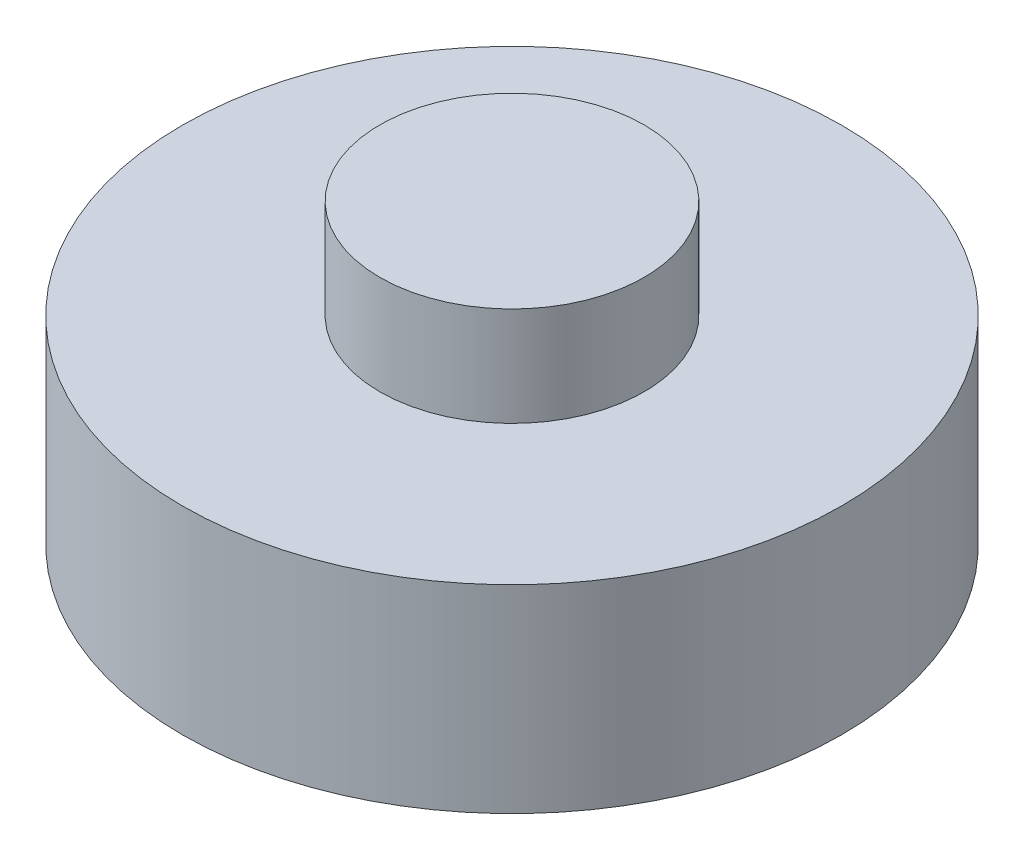
ISO-10303-21;
HEADER;
FILE_DESCRIPTION(('STEP AP214'),'2;1');
FILE_NAME('part.step','',(''),(''),'','','');
FILE_SCHEMA(('AUTOMOTIVE_DESIGN { 1 0 10303 214 1 1 1 1 }'));
ENDSEC;
DATA;
#1=APPLICATION_CONTEXT('core data for automotive mechanical design processes');
#2=APPLICATION_PROTOCOL_DEFINITION('international standard','automotive_design',2000,#1);
#3=PRODUCT_CONTEXT('',#1,'mechanical');
#4=PRODUCT('Part','Part','',(#3));
#5=PRODUCT_RELATED_PRODUCT_CATEGORY('part','',(#4));
#6=PRODUCT_DEFINITION_FORMATION('','',#4);
#7=PRODUCT_DEFINITION_CONTEXT('part definition',#1,'design');
#8=PRODUCT_DEFINITION('design','',#6,#7);
#9=PRODUCT_DEFINITION_SHAPE('','',#8);
#10=(LENGTH_UNIT() NAMED_UNIT(*) SI_UNIT(.MILLI.,.METRE.));
#11=(NAMED_UNIT(*) PLANE_ANGLE_UNIT() SI_UNIT($,.RADIAN.));
#12=(NAMED_UNIT(*) SI_UNIT($,.STERADIAN.) SOLID_ANGLE_UNIT());
#13=UNCERTAINTY_MEASURE_WITH_UNIT(LENGTH_MEASURE(1.E-05),#10,'distance_accuracy_value','');
#14=(GEOMETRIC_REPRESENTATION_CONTEXT(3) GLOBAL_UNCERTAINTY_ASSIGNED_CONTEXT((#13)) GLOBAL_UNIT_ASSIGNED_CONTEXT((#10,
#11,#12)) REPRESENTATION_CONTEXT('',''));
#15=CARTESIAN_POINT('',(0.,0.,0.));
#16=DIRECTION('',(0.,0.,1.));
#17=DIRECTION('',(1.,0.,0.));
#18=AXIS2_PLACEMENT_3D('',#15,#16,#17);
#19=CARTESIAN_POINT('',(0.,30.,0.));
#20=DIRECTION('',(0.,-1.,0.));
#21=DIRECTION('',(0.,0.,-1.));
#22=AXIS2_PLACEMENT_3D('',#19,#20,#21);
#23=CYLINDRICAL_SURFACE('',#22,49.9);
#24=CARTESIAN_POINT('',(0.,30.,0.));
#25=DIRECTION('',(0.,1.,0.));
#26=DIRECTION('',(0.,0.,1.));
#27=AXIS2_PLACEMENT_3D('',#24,#25,#26);
#28=CIRCLE('',#27,49.9);
#29=CARTESIAN_POINT('',(0.,30.,49.9));
#30=VERTEX_POINT('',#29);
#31=EDGE_CURVE('E43',#30,#30,#28,.T.);
#32=ORIENTED_EDGE('',*,*,#31,.F.);
#33=EDGE_LOOP('',(#32));
#34=FACE_BOUND('',#33,.T.);
#35=CARTESIAN_POINT('',(0.,0.,0.));
#36=DIRECTION('',(0.,1.,0.));
#37=DIRECTION('',(0.,0.,1.));
#38=AXIS2_PLACEMENT_3D('',#35,#36,#37);
#39=CIRCLE('',#38,49.9);
#40=CARTESIAN_POINT('',(0.,0.,49.9));
#41=VERTEX_POINT('',#40);
#42=EDGE_CURVE('E39',#41,#41,#39,.T.);
#43=ORIENTED_EDGE('',*,*,#42,.T.);
#44=EDGE_LOOP('',(#43));
#45=FACE_BOUND('',#44,.T.);
#46=ADVANCED_FACE('F36',(#34,#45),#23,.T.);
#47=CARTESIAN_POINT('',(0.,30.,0.));
#48=DIRECTION('',(0.,1.,0.));
#49=DIRECTION('',(0.,0.,1.));
#50=AXIS2_PLACEMENT_3D('',#47,#48,#49);
#51=PLANE('',#50);
#52=CARTESIAN_POINT('',(0.,30.,0.));
#53=DIRECTION('',(0.,1.,0.));
#54=DIRECTION('',(0.,0.,1.));
#55=AXIS2_PLACEMENT_3D('',#52,#53,#54);
#56=CIRCLE('',#55,20.);
#57=CARTESIAN_POINT('',(0.,30.,20.));
#58=VERTEX_POINT('',#57);
#59=EDGE_CURVE('E10',#58,#58,#56,.T.);
#60=ORIENTED_EDGE('',*,*,#59,.F.);
#61=EDGE_LOOP('',(#60));
#62=FACE_BOUND('',#61,.T.);
#63=ORIENTED_EDGE('',*,*,#31,.T.);
#64=EDGE_LOOP('',(#63));
#65=FACE_BOUND('',#64,.T.);
#66=ADVANCED_FACE('F60',(#62,#65),#51,.T.);
#67=CARTESIAN_POINT('',(0.,0.,0.));
#68=DIRECTION('',(0.,1.,0.));
#69=DIRECTION('',(0.,0.,1.));
#70=AXIS2_PLACEMENT_3D('',#67,#68,#69);
#71=PLANE('',#70);
#72=ORIENTED_EDGE('',*,*,#42,.F.);
#73=EDGE_LOOP('',(#72));
#74=FACE_BOUND('',#73,.T.);
#75=ADVANCED_FACE('F57',(#74),#71,.F.);
#76=CARTESIAN_POINT('',(0.,45.,0.));
#77=DIRECTION('',(0.,-1.,0.));
#78=DIRECTION('',(0.,0.,-1.));
#79=AXIS2_PLACEMENT_3D('',#76,#77,#78);
#80=CYLINDRICAL_SURFACE('',#79,20.);
#81=CARTESIAN_POINT('',(0.,45.,0.));
#82=DIRECTION('',(0.,1.,0.));
#83=DIRECTION('',(0.,0.,1.));
#84=AXIS2_PLACEMENT_3D('',#81,#82,#83);
#85=CIRCLE('',#84,20.);
#86=CARTESIAN_POINT('',(0.,45.,20.));
#87=VERTEX_POINT('',#86);
#88=EDGE_CURVE('E49',#87,#87,#85,.T.);
#89=ORIENTED_EDGE('',*,*,#88,.F.);
#90=EDGE_LOOP('',(#89));
#91=FACE_BOUND('',#90,.T.);
#92=ORIENTED_EDGE('',*,*,#59,.T.);
#93=EDGE_LOOP('',(#92));
#94=FACE_BOUND('',#93,.T.);
#95=ADVANCED_FACE('F59',(#91,#94),#80,.T.);
#96=CARTESIAN_POINT('',(0.,45.,0.));
#97=DIRECTION('',(0.,1.,0.));
#98=DIRECTION('',(0.,0.,1.));
#99=AXIS2_PLACEMENT_3D('',#96,#97,#98);
#100=PLANE('',#99);
#101=ORIENTED_EDGE('',*,*,#88,.T.);
#102=EDGE_LOOP('',(#101));
#103=FACE_BOUND('',#102,.T.);
#104=ADVANCED_FACE('F65',(#103),#100,.T.);
#105=CLOSED_SHELL('',(#46,#66,#75,#95,#104));
#106=MANIFOLD_SOLID_BREP('B2',#105);
#107=ADVANCED_BREP_SHAPE_REPRESENTATION('',(#18,#106),#14);
#108=SHAPE_DEFINITION_REPRESENTATION(#9,#107);
ENDSEC;
END-ISO-10303-21;
